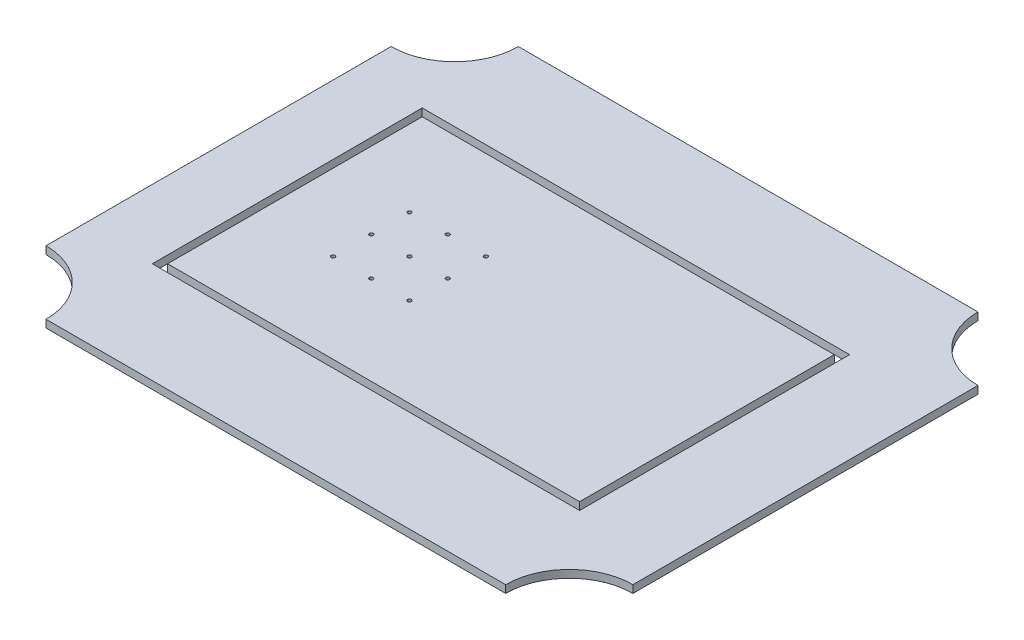
ISO-10303-21;
HEADER;
FILE_DESCRIPTION(('STEP AP214'),'2;1');
FILE_NAME('part.step','',(''),(''),'','','');
FILE_SCHEMA(('AUTOMOTIVE_DESIGN { 1 0 10303 214 1 1 1 1 }'));
ENDSEC;
DATA;
#1=APPLICATION_CONTEXT('core data for automotive mechanical design processes');
#2=APPLICATION_PROTOCOL_DEFINITION('international standard','automotive_design',2000,#1);
#3=PRODUCT_CONTEXT('',#1,'mechanical');
#4=PRODUCT('Part','Part','',(#3));
#5=PRODUCT_RELATED_PRODUCT_CATEGORY('part','',(#4));
#6=PRODUCT_DEFINITION_FORMATION('','',#4);
#7=PRODUCT_DEFINITION_CONTEXT('part definition',#1,'design');
#8=PRODUCT_DEFINITION('design','',#6,#7);
#9=PRODUCT_DEFINITION_SHAPE('','',#8);
#10=(LENGTH_UNIT() NAMED_UNIT(*) SI_UNIT(.MILLI.,.METRE.));
#11=(NAMED_UNIT(*) PLANE_ANGLE_UNIT() SI_UNIT($,.RADIAN.));
#12=(NAMED_UNIT(*) SI_UNIT($,.STERADIAN.) SOLID_ANGLE_UNIT());
#13=UNCERTAINTY_MEASURE_WITH_UNIT(LENGTH_MEASURE(1.E-05),#10,'distance_accuracy_value','');
#14=(GEOMETRIC_REPRESENTATION_CONTEXT(3) GLOBAL_UNCERTAINTY_ASSIGNED_CONTEXT((#13)) GLOBAL_UNIT_ASSIGNED_CONTEXT((#10,
#11,#12)) REPRESENTATION_CONTEXT('',''));
#15=CARTESIAN_POINT('',(0.,0.,0.));
#16=DIRECTION('',(0.,0.,1.));
#17=DIRECTION('',(1.,0.,0.));
#18=AXIS2_PLACEMENT_3D('',#15,#16,#17);
#19=CARTESIAN_POINT('',(187.933095957237,6.,0.));
#20=DIRECTION('',(1.,0.,0.));
#21=DIRECTION('',(0.,0.,-1.));
#22=AXIS2_PLACEMENT_3D('',#19,#20,#21);
#23=PLANE('',#22);
#24=DIRECTION('',(0.,0.,1.));
#25=VECTOR('',#24,1.);
#26=CARTESIAN_POINT('',(187.933095957237,0.,0.));
#27=LINE('',#26,#25);
#28=CARTESIAN_POINT('',(187.933095957237,0.,-100.));
#29=VERTEX_POINT('',#28);
#30=CARTESIAN_POINT('',(187.933095957237,0.,100.));
#31=VERTEX_POINT('',#30);
#32=EDGE_CURVE('E227',#29,#31,#27,.T.);
#33=ORIENTED_EDGE('',*,*,#32,.F.);
#34=DIRECTION('',(0.,-1.,0.));
#35=VECTOR('',#34,1.);
#36=CARTESIAN_POINT('',(187.933095957237,6.,-100.));
#37=LINE('',#36,#35);
#38=CARTESIAN_POINT('',(187.933095957237,6.,-100.));
#39=VERTEX_POINT('',#38);
#40=EDGE_CURVE('E14',#39,#29,#37,.T.);
#41=ORIENTED_EDGE('',*,*,#40,.F.);
#42=DIRECTION('',(0.,0.,1.));
#43=VECTOR('',#42,1.);
#44=CARTESIAN_POINT('',(187.933095957237,6.,0.));
#45=LINE('',#44,#43);
#46=CARTESIAN_POINT('',(187.933095957237,6.,100.));
#47=VERTEX_POINT('',#46);
#48=EDGE_CURVE('E152',#39,#47,#45,.T.);
#49=ORIENTED_EDGE('',*,*,#48,.T.);
#50=DIRECTION('',(0.,-1.,0.));
#51=VECTOR('',#50,1.);
#52=CARTESIAN_POINT('',(187.933095957237,6.,100.));
#53=LINE('',#52,#51);
#54=EDGE_CURVE('E129',#47,#31,#53,.T.);
#55=ORIENTED_EDGE('',*,*,#54,.T.);
#56=EDGE_LOOP('',(#33,#41,#49,#55));
#57=FACE_BOUND('',#56,.T.);
#58=ADVANCED_FACE('F89',(#57),#23,.T.);
#59=CARTESIAN_POINT('',(0.,6.,-100.));
#60=DIRECTION('',(0.,0.,-1.));
#61=DIRECTION('',(-1.,0.,0.));
#62=AXIS2_PLACEMENT_3D('',#59,#60,#61);
#63=PLANE('',#62);
#64=DIRECTION('',(1.,0.,0.));
#65=VECTOR('',#64,1.);
#66=CARTESIAN_POINT('',(0.,0.,-100.));
#67=LINE('',#66,#65);
#68=CARTESIAN_POINT('',(-135.691499512018,0.,-100.));
#69=VERTEX_POINT('',#68);
#70=EDGE_CURVE('E141',#69,#29,#67,.T.);
#71=ORIENTED_EDGE('',*,*,#70,.F.);
#72=DIRECTION('',(0.,-1.,0.));
#73=VECTOR('',#72,1.);
#74=CARTESIAN_POINT('',(-135.691499512018,6.,-100.));
#75=LINE('',#74,#73);
#76=CARTESIAN_POINT('',(-135.691499512018,6.,-100.));
#77=VERTEX_POINT('',#76);
#78=EDGE_CURVE('E98',#77,#69,#75,.T.);
#79=ORIENTED_EDGE('',*,*,#78,.F.);
#80=DIRECTION('',(1.,0.,0.));
#81=VECTOR('',#80,1.);
#82=CARTESIAN_POINT('',(0.,6.,-100.));
#83=LINE('',#82,#81);
#84=EDGE_CURVE('E139',#77,#39,#83,.T.);
#85=ORIENTED_EDGE('',*,*,#84,.T.);
#86=ORIENTED_EDGE('',*,*,#40,.T.);
#87=EDGE_LOOP('',(#71,#79,#85,#86));
#88=FACE_BOUND('',#87,.T.);
#89=ADVANCED_FACE('F137',(#88),#63,.T.);
#90=CARTESIAN_POINT('',(-135.691499512018,6.,0.));
#91=DIRECTION('',(1.,0.,0.));
#92=DIRECTION('',(0.,0.,-1.));
#93=AXIS2_PLACEMENT_3D('',#90,#91,#92);
#94=PLANE('',#93);
#95=DIRECTION('',(0.,0.,1.));
#96=VECTOR('',#95,1.);
#97=CARTESIAN_POINT('',(-135.691499512018,0.,0.));
#98=LINE('',#97,#96);
#99=CARTESIAN_POINT('',(-135.691499512018,0.,100.));
#100=VERTEX_POINT('',#99);
#101=EDGE_CURVE('E237',#69,#100,#98,.T.);
#102=ORIENTED_EDGE('',*,*,#101,.T.);
#103=DIRECTION('',(0.,-1.,0.));
#104=VECTOR('',#103,1.);
#105=CARTESIAN_POINT('',(-135.691499512018,6.,100.));
#106=LINE('',#105,#104);
#107=CARTESIAN_POINT('',(-135.691499512018,6.,100.));
#108=VERTEX_POINT('',#107);
#109=EDGE_CURVE('E144',#108,#100,#106,.T.);
#110=ORIENTED_EDGE('',*,*,#109,.F.);
#111=DIRECTION('',(0.,0.,1.));
#112=VECTOR('',#111,1.);
#113=CARTESIAN_POINT('',(-135.691499512018,6.,0.));
#114=LINE('',#113,#112);
#115=EDGE_CURVE('E146',#77,#108,#114,.T.);
#116=ORIENTED_EDGE('',*,*,#115,.F.);
#117=ORIENTED_EDGE('',*,*,#78,.T.);
#118=EDGE_LOOP('',(#102,#110,#116,#117));
#119=FACE_BOUND('',#118,.T.);
#120=ADVANCED_FACE('F147',(#119),#94,.F.);
#121=CARTESIAN_POINT('',(-75.6914995120183,6.,30.));
#122=DIRECTION('',(0.,-1.,0.));
#123=DIRECTION('',(0.,0.,-1.));
#124=AXIS2_PLACEMENT_3D('',#121,#122,#123);
#125=CYLINDRICAL_SURFACE('',#124,1.49999999999994);
#126=CARTESIAN_POINT('',(-75.6914995120183,6.,30.));
#127=DIRECTION('',(0.,1.,0.));
#128=DIRECTION('',(0.,0.,1.));
#129=AXIS2_PLACEMENT_3D('',#126,#127,#128);
#130=CIRCLE('',#129,1.49999999999994);
#131=CARTESIAN_POINT('',(-75.6914995120183,6.,31.4999999999999));
#132=VERTEX_POINT('',#131);
#133=EDGE_CURVE('E434',#132,#132,#130,.F.);
#134=ORIENTED_EDGE('',*,*,#133,.F.);
#135=EDGE_LOOP('',(#134));
#136=FACE_BOUND('',#135,.T.);
#137=CARTESIAN_POINT('',(-75.6914995120183,0.,30.));
#138=DIRECTION('',(0.,1.,0.));
#139=DIRECTION('',(0.,0.,1.));
#140=AXIS2_PLACEMENT_3D('',#137,#138,#139);
#141=CIRCLE('',#140,1.49999999999994);
#142=CARTESIAN_POINT('',(-75.6914995120183,0.,31.4999999999999));
#143=VERTEX_POINT('',#142);
#144=EDGE_CURVE('E240',#143,#143,#141,.F.);
#145=ORIENTED_EDGE('',*,*,#144,.T.);
#146=EDGE_LOOP('',(#145));
#147=FACE_BOUND('',#146,.T.);
#148=ADVANCED_FACE('F311',(#136,#147),#125,.F.);
#149=CARTESIAN_POINT('',(0.,6.,100.));
#150=DIRECTION('',(0.,0.,-1.));
#151=DIRECTION('',(-1.,0.,0.));
#152=AXIS2_PLACEMENT_3D('',#149,#150,#151);
#153=PLANE('',#152);
#154=DIRECTION('',(1.,0.,0.));
#155=VECTOR('',#154,1.);
#156=CARTESIAN_POINT('',(0.,0.,100.));
#157=LINE('',#156,#155);
#158=EDGE_CURVE('E122',#100,#31,#157,.T.);
#159=ORIENTED_EDGE('',*,*,#158,.T.);
#160=ORIENTED_EDGE('',*,*,#54,.F.);
#161=DIRECTION('',(1.,0.,0.));
#162=VECTOR('',#161,1.);
#163=CARTESIAN_POINT('',(0.,6.,100.));
#164=LINE('',#163,#162);
#165=EDGE_CURVE('E106',#108,#47,#164,.T.);
#166=ORIENTED_EDGE('',*,*,#165,.F.);
#167=ORIENTED_EDGE('',*,*,#109,.T.);
#168=EDGE_LOOP('',(#159,#160,#166,#167));
#169=FACE_BOUND('',#168,.T.);
#170=ADVANCED_FACE('F221',(#169),#153,.F.);
#171=CARTESIAN_POINT('',(-75.6914995120183,6.,0.));
#172=DIRECTION('',(0.,-1.,0.));
#173=DIRECTION('',(0.,0.,-1.));
#174=AXIS2_PLACEMENT_3D('',#171,#172,#173);
#175=CYLINDRICAL_SURFACE('',#174,1.49999999999994);
#176=CARTESIAN_POINT('',(-75.6914995120183,6.,0.));
#177=DIRECTION('',(0.,1.,0.));
#178=DIRECTION('',(0.,0.,1.));
#179=AXIS2_PLACEMENT_3D('',#176,#177,#178);
#180=CIRCLE('',#179,1.49999999999994);
#181=CARTESIAN_POINT('',(-75.6914995120183,6.,1.49999999999994));
#182=VERTEX_POINT('',#181);
#183=EDGE_CURVE('E156',#182,#182,#180,.T.);
#184=ORIENTED_EDGE('',*,*,#183,.T.);
#185=EDGE_LOOP('',(#184));
#186=FACE_BOUND('',#185,.T.);
#187=CARTESIAN_POINT('',(-75.6914995120183,0.,0.));
#188=DIRECTION('',(0.,1.,0.));
#189=DIRECTION('',(0.,0.,1.));
#190=AXIS2_PLACEMENT_3D('',#187,#188,#189);
#191=CIRCLE('',#190,1.49999999999994);
#192=CARTESIAN_POINT('',(-75.6914995120183,0.,1.49999999999994));
#193=VERTEX_POINT('',#192);
#194=EDGE_CURVE('E225',#193,#193,#191,.T.);
#195=ORIENTED_EDGE('',*,*,#194,.F.);
#196=EDGE_LOOP('',(#195));
#197=FACE_BOUND('',#196,.T.);
#198=ADVANCED_FACE('F217',(#186,#197),#175,.F.);
#199=CARTESIAN_POINT('',(-75.6914995120183,6.,-30.));
#200=DIRECTION('',(0.,-1.,0.));
#201=DIRECTION('',(0.,0.,-1.));
#202=AXIS2_PLACEMENT_3D('',#199,#200,#201);
#203=CYLINDRICAL_SURFACE('',#202,1.49999999999994);
#204=CARTESIAN_POINT('',(-75.6914995120183,6.,-30.));
#205=DIRECTION('',(0.,1.,0.));
#206=DIRECTION('',(0.,0.,1.));
#207=AXIS2_PLACEMENT_3D('',#204,#205,#206);
#208=CIRCLE('',#207,1.49999999999994);
#209=CARTESIAN_POINT('',(-75.6914995120183,6.,-28.5000000000001));
#210=VERTEX_POINT('',#209);
#211=EDGE_CURVE('E171',#210,#210,#208,.T.);
#212=ORIENTED_EDGE('',*,*,#211,.T.);
#213=EDGE_LOOP('',(#212));
#214=FACE_BOUND('',#213,.T.);
#215=CARTESIAN_POINT('',(-75.6914995120183,0.,-30.));
#216=DIRECTION('',(0.,1.,0.));
#217=DIRECTION('',(0.,0.,1.));
#218=AXIS2_PLACEMENT_3D('',#215,#216,#217);
#219=CIRCLE('',#218,1.49999999999994);
#220=CARTESIAN_POINT('',(-75.6914995120183,0.,-28.5000000000001));
#221=VERTEX_POINT('',#220);
#222=EDGE_CURVE('E228',#221,#221,#219,.T.);
#223=ORIENTED_EDGE('',*,*,#222,.F.);
#224=EDGE_LOOP('',(#223));
#225=FACE_BOUND('',#224,.T.);
#226=ADVANCED_FACE('F220',(#214,#225),#203,.F.);
#227=CARTESIAN_POINT('',(-45.6914995120183,6.,-30.));
#228=DIRECTION('',(0.,-1.,0.));
#229=DIRECTION('',(0.,0.,-1.));
#230=AXIS2_PLACEMENT_3D('',#227,#228,#229);
#231=CYLINDRICAL_SURFACE('',#230,1.49999999999994);
#232=CARTESIAN_POINT('',(-45.6914995120183,6.,-30.));
#233=DIRECTION('',(0.,1.,0.));
#234=DIRECTION('',(0.,0.,1.));
#235=AXIS2_PLACEMENT_3D('',#232,#233,#234);
#236=CIRCLE('',#235,1.49999999999994);
#237=CARTESIAN_POINT('',(-45.6914995120183,6.,-28.5000000000001));
#238=VERTEX_POINT('',#237);
#239=EDGE_CURVE('E176',#238,#238,#236,.T.);
#240=ORIENTED_EDGE('',*,*,#239,.T.);
#241=EDGE_LOOP('',(#240));
#242=FACE_BOUND('',#241,.T.);
#243=CARTESIAN_POINT('',(-45.6914995120183,0.,-30.));
#244=DIRECTION('',(0.,1.,0.));
#245=DIRECTION('',(0.,0.,1.));
#246=AXIS2_PLACEMENT_3D('',#243,#244,#245);
#247=CIRCLE('',#246,1.49999999999994);
#248=CARTESIAN_POINT('',(-45.6914995120183,0.,-28.5000000000001));
#249=VERTEX_POINT('',#248);
#250=EDGE_CURVE('E232',#249,#249,#247,.T.);
#251=ORIENTED_EDGE('',*,*,#250,.F.);
#252=EDGE_LOOP('',(#251));
#253=FACE_BOUND('',#252,.T.);
#254=ADVANCED_FACE('F260',(#242,#253),#231,.F.);
#255=CARTESIAN_POINT('',(-45.6914995120183,6.,0.));
#256=DIRECTION('',(0.,-1.,0.));
#257=DIRECTION('',(0.,0.,-1.));
#258=AXIS2_PLACEMENT_3D('',#255,#256,#257);
#259=CYLINDRICAL_SURFACE('',#258,1.49999999999992);
#260=CARTESIAN_POINT('',(-45.6914995120183,6.,0.));
#261=DIRECTION('',(0.,1.,0.));
#262=DIRECTION('',(0.,0.,1.));
#263=AXIS2_PLACEMENT_3D('',#260,#261,#262);
#264=CIRCLE('',#263,1.49999999999992);
#265=CARTESIAN_POINT('',(-45.6914995120183,6.,1.49999999999992));
#266=VERTEX_POINT('',#265);
#267=EDGE_CURVE('E181',#266,#266,#264,.T.);
#268=ORIENTED_EDGE('',*,*,#267,.T.);
#269=EDGE_LOOP('',(#268));
#270=FACE_BOUND('',#269,.T.);
#271=CARTESIAN_POINT('',(-45.6914995120183,0.,0.));
#272=DIRECTION('',(0.,1.,0.));
#273=DIRECTION('',(0.,0.,1.));
#274=AXIS2_PLACEMENT_3D('',#271,#272,#273);
#275=CIRCLE('',#274,1.49999999999992);
#276=CARTESIAN_POINT('',(-45.6914995120183,0.,1.49999999999992));
#277=VERTEX_POINT('',#276);
#278=EDGE_CURVE('E287',#277,#277,#275,.T.);
#279=ORIENTED_EDGE('',*,*,#278,.F.);
#280=EDGE_LOOP('',(#279));
#281=FACE_BOUND('',#280,.T.);
#282=ADVANCED_FACE('F202',(#270,#281),#259,.F.);
#283=CARTESIAN_POINT('',(-45.6914995120183,6.,30.));
#284=DIRECTION('',(0.,-1.,0.));
#285=DIRECTION('',(0.,0.,-1.));
#286=AXIS2_PLACEMENT_3D('',#283,#284,#285);
#287=CYLINDRICAL_SURFACE('',#286,1.49999999999994);
#288=CARTESIAN_POINT('',(-45.6914995120183,6.,30.));
#289=DIRECTION('',(0.,1.,0.));
#290=DIRECTION('',(0.,0.,1.));
#291=AXIS2_PLACEMENT_3D('',#288,#289,#290);
#292=CIRCLE('',#291,1.49999999999994);
#293=CARTESIAN_POINT('',(-45.6914995120183,6.,31.4999999999999));
#294=VERTEX_POINT('',#293);
#295=EDGE_CURVE('E192',#294,#294,#292,.F.);
#296=ORIENTED_EDGE('',*,*,#295,.F.);
#297=EDGE_LOOP('',(#296));
#298=FACE_BOUND('',#297,.T.);
#299=CARTESIAN_POINT('',(-45.6914995120183,0.,30.));
#300=DIRECTION('',(0.,1.,0.));
#301=DIRECTION('',(0.,0.,1.));
#302=AXIS2_PLACEMENT_3D('',#299,#300,#301);
#303=CIRCLE('',#302,1.49999999999994);
#304=CARTESIAN_POINT('',(-45.6914995120183,0.,31.4999999999999));
#305=VERTEX_POINT('',#304);
#306=EDGE_CURVE('E283',#305,#305,#303,.F.);
#307=ORIENTED_EDGE('',*,*,#306,.T.);
#308=EDGE_LOOP('',(#307));
#309=FACE_BOUND('',#308,.T.);
#310=ADVANCED_FACE('F267',(#298,#309),#287,.F.);
#311=CARTESIAN_POINT('',(-15.6914995120183,6.,30.));
#312=DIRECTION('',(0.,-1.,0.));
#313=DIRECTION('',(0.,0.,-1.));
#314=AXIS2_PLACEMENT_3D('',#311,#312,#313);
#315=CYLINDRICAL_SURFACE('',#314,1.49999999999989);
#316=CARTESIAN_POINT('',(-15.6914995120183,6.,30.));
#317=DIRECTION('',(0.,1.,0.));
#318=DIRECTION('',(0.,0.,1.));
#319=AXIS2_PLACEMENT_3D('',#316,#317,#318);
#320=CIRCLE('',#319,1.49999999999989);
#321=CARTESIAN_POINT('',(-15.6914995120183,6.,31.4999999999999));
#322=VERTEX_POINT('',#321);
#323=EDGE_CURVE('E187',#322,#322,#320,.T.);
#324=ORIENTED_EDGE('',*,*,#323,.T.);
#325=EDGE_LOOP('',(#324));
#326=FACE_BOUND('',#325,.T.);
#327=CARTESIAN_POINT('',(-15.6914995120183,0.,30.));
#328=DIRECTION('',(0.,1.,0.));
#329=DIRECTION('',(0.,0.,1.));
#330=AXIS2_PLACEMENT_3D('',#327,#328,#329);
#331=CIRCLE('',#330,1.49999999999989);
#332=CARTESIAN_POINT('',(-15.6914995120183,0.,31.4999999999999));
#333=VERTEX_POINT('',#332);
#334=EDGE_CURVE('E281',#333,#333,#331,.T.);
#335=ORIENTED_EDGE('',*,*,#334,.F.);
#336=EDGE_LOOP('',(#335));
#337=FACE_BOUND('',#336,.T.);
#338=ADVANCED_FACE('F269',(#326,#337),#315,.F.);
#339=CARTESIAN_POINT('',(-15.6914995120183,6.,0.));
#340=DIRECTION('',(0.,-1.,0.));
#341=DIRECTION('',(0.,0.,-1.));
#342=AXIS2_PLACEMENT_3D('',#339,#340,#341);
#343=CYLINDRICAL_SURFACE('',#342,1.49999999999989);
#344=CARTESIAN_POINT('',(-15.6914995120183,6.,0.));
#345=DIRECTION('',(0.,1.,0.));
#346=DIRECTION('',(0.,0.,1.));
#347=AXIS2_PLACEMENT_3D('',#344,#345,#346);
#348=CIRCLE('',#347,1.49999999999989);
#349=CARTESIAN_POINT('',(-15.6914995120183,6.,1.49999999999988));
#350=VERTEX_POINT('',#349);
#351=EDGE_CURVE('E193',#350,#350,#348,.F.);
#352=ORIENTED_EDGE('',*,*,#351,.F.);
#353=EDGE_LOOP('',(#352));
#354=FACE_BOUND('',#353,.T.);
#355=CARTESIAN_POINT('',(-15.6914995120183,0.,0.));
#356=DIRECTION('',(0.,1.,0.));
#357=DIRECTION('',(0.,0.,1.));
#358=AXIS2_PLACEMENT_3D('',#355,#356,#357);
#359=CIRCLE('',#358,1.49999999999989);
#360=CARTESIAN_POINT('',(-15.6914995120183,0.,1.49999999999988));
#361=VERTEX_POINT('',#360);
#362=EDGE_CURVE('E284',#361,#361,#359,.F.);
#363=ORIENTED_EDGE('',*,*,#362,.T.);
#364=EDGE_LOOP('',(#363));
#365=FACE_BOUND('',#364,.T.);
#366=ADVANCED_FACE('F91',(#354,#365),#343,.F.);
#367=CARTESIAN_POINT('',(-15.6914995120183,6.,-30.));
#368=DIRECTION('',(0.,-1.,0.));
#369=DIRECTION('',(0.,0.,-1.));
#370=AXIS2_PLACEMENT_3D('',#367,#368,#369);
#371=CYLINDRICAL_SURFACE('',#370,1.49999999999989);
#372=CARTESIAN_POINT('',(-15.6914995120183,6.,-30.));
#373=DIRECTION('',(0.,1.,0.));
#374=DIRECTION('',(0.,0.,1.));
#375=AXIS2_PLACEMENT_3D('',#372,#373,#374);
#376=CIRCLE('',#375,1.49999999999989);
#377=CARTESIAN_POINT('',(-15.6914995120183,6.,-28.5000000000001));
#378=VERTEX_POINT('',#377);
#379=EDGE_CURVE('E247',#378,#378,#376,.F.);
#380=ORIENTED_EDGE('',*,*,#379,.F.);
#381=EDGE_LOOP('',(#380));
#382=FACE_BOUND('',#381,.T.);
#383=CARTESIAN_POINT('',(-15.6914995120183,0.,-30.));
#384=DIRECTION('',(0.,1.,0.));
#385=DIRECTION('',(0.,0.,1.));
#386=AXIS2_PLACEMENT_3D('',#383,#384,#385);
#387=CIRCLE('',#386,1.49999999999989);
#388=CARTESIAN_POINT('',(-15.6914995120183,0.,-28.5000000000001));
#389=VERTEX_POINT('',#388);
#390=EDGE_CURVE('E243',#389,#389,#387,.F.);
#391=ORIENTED_EDGE('',*,*,#390,.T.);
#392=EDGE_LOOP('',(#391));
#393=FACE_BOUND('',#392,.T.);
#394=ADVANCED_FACE('F208',(#382,#393),#371,.F.);
#395=CARTESIAN_POINT('',(0.,6.,0.));
#396=DIRECTION('',(0.,1.,0.));
#397=DIRECTION('',(0.,0.,1.));
#398=AXIS2_PLACEMENT_3D('',#395,#396,#397);
#399=PLANE('',#398);
#400=ORIENTED_EDGE('',*,*,#351,.T.);
#401=EDGE_LOOP('',(#400));
#402=FACE_BOUND('',#401,.T.);
#403=ORIENTED_EDGE('',*,*,#323,.F.);
#404=EDGE_LOOP('',(#403));
#405=FACE_BOUND('',#404,.T.);
#406=ORIENTED_EDGE('',*,*,#295,.T.);
#407=EDGE_LOOP('',(#406));
#408=FACE_BOUND('',#407,.T.);
#409=ORIENTED_EDGE('',*,*,#267,.F.);
#410=EDGE_LOOP('',(#409));
#411=FACE_BOUND('',#410,.T.);
#412=ORIENTED_EDGE('',*,*,#239,.F.);
#413=EDGE_LOOP('',(#412));
#414=FACE_BOUND('',#413,.T.);
#415=ORIENTED_EDGE('',*,*,#211,.F.);
#416=EDGE_LOOP('',(#415));
#417=FACE_BOUND('',#416,.T.);
#418=ORIENTED_EDGE('',*,*,#183,.F.);
#419=EDGE_LOOP('',(#418));
#420=FACE_BOUND('',#419,.T.);
#421=ORIENTED_EDGE('',*,*,#48,.F.);
#422=ORIENTED_EDGE('',*,*,#84,.F.);
#423=ORIENTED_EDGE('',*,*,#115,.T.);
#424=ORIENTED_EDGE('',*,*,#165,.T.);
#425=EDGE_LOOP('',(#421,#422,#423,#424));
#426=FACE_BOUND('',#425,.T.);
#427=ORIENTED_EDGE('',*,*,#133,.T.);
#428=EDGE_LOOP('',(#427));
#429=FACE_BOUND('',#428,.T.);
#430=ORIENTED_EDGE('',*,*,#379,.T.);
#431=EDGE_LOOP('',(#430));
#432=FACE_BOUND('',#431,.T.);
#433=ADVANCED_FACE('F150',(#402,#405,#408,#411,#414,#417,#420,#426,#429,#432),#399,.T.);
#434=CARTESIAN_POINT('',(0.,0.,0.));
#435=DIRECTION('',(0.,1.,0.));
#436=DIRECTION('',(0.,0.,1.));
#437=AXIS2_PLACEMENT_3D('',#434,#435,#436);
#438=PLANE('',#437);
#439=ORIENTED_EDGE('',*,*,#362,.F.);
#440=EDGE_LOOP('',(#439));
#441=FACE_BOUND('',#440,.T.);
#442=ORIENTED_EDGE('',*,*,#334,.T.);
#443=EDGE_LOOP('',(#442));
#444=FACE_BOUND('',#443,.T.);
#445=ORIENTED_EDGE('',*,*,#306,.F.);
#446=EDGE_LOOP('',(#445));
#447=FACE_BOUND('',#446,.T.);
#448=ORIENTED_EDGE('',*,*,#278,.T.);
#449=EDGE_LOOP('',(#448));
#450=FACE_BOUND('',#449,.T.);
#451=ORIENTED_EDGE('',*,*,#250,.T.);
#452=EDGE_LOOP('',(#451));
#453=FACE_BOUND('',#452,.T.);
#454=ORIENTED_EDGE('',*,*,#222,.T.);
#455=EDGE_LOOP('',(#454));
#456=FACE_BOUND('',#455,.T.);
#457=ORIENTED_EDGE('',*,*,#194,.T.);
#458=EDGE_LOOP('',(#457));
#459=FACE_BOUND('',#458,.T.);
#460=ORIENTED_EDGE('',*,*,#32,.T.);
#461=ORIENTED_EDGE('',*,*,#158,.F.);
#462=ORIENTED_EDGE('',*,*,#101,.F.);
#463=ORIENTED_EDGE('',*,*,#70,.T.);
#464=EDGE_LOOP('',(#460,#461,#462,#463));
#465=FACE_BOUND('',#464,.T.);
#466=ORIENTED_EDGE('',*,*,#144,.F.);
#467=EDGE_LOOP('',(#466));
#468=FACE_BOUND('',#467,.T.);
#469=ORIENTED_EDGE('',*,*,#390,.F.);
#470=EDGE_LOOP('',(#469));
#471=FACE_BOUND('',#470,.T.);
#472=ADVANCED_FACE('F207',(#441,#444,#447,#450,#453,#456,#459,#465,#468,#471),#438,.F.);
#473=CLOSED_SHELL('',(#58,#89,#120,#148,#170,#198,#226,#254,#282,#310,#338,#366,#394,#433,#472));
#474=MANIFOLD_SOLID_BREP('B2',#473);
#475=CARTESIAN_POINT('',(-141.691499512018,6.,0.));
#476=DIRECTION('',(1.,0.,0.));
#477=DIRECTION('',(0.,0.,-1.));
#478=AXIS2_PLACEMENT_3D('',#475,#476,#477);
#479=PLANE('',#478);
#480=DIRECTION('',(0.,0.,1.));
#481=VECTOR('',#480,1.);
#482=CARTESIAN_POINT('',(-141.691499512018,0.,0.));
#483=LINE('',#482,#481);
#484=CARTESIAN_POINT('',(-141.691499512018,0.,-106.));
#485=VERTEX_POINT('',#484);
#486=CARTESIAN_POINT('',(-141.691499512018,0.,106.));
#487=VERTEX_POINT('',#486);
#488=EDGE_CURVE('E610',#485,#487,#483,.T.);
#489=ORIENTED_EDGE('',*,*,#488,.F.);
#490=DIRECTION('',(0.,-1.,0.));
#491=VECTOR('',#490,1.);
#492=CARTESIAN_POINT('',(-141.691499512018,6.,-106.));
#493=LINE('',#492,#491);
#494=CARTESIAN_POINT('',(-141.691499512018,6.,-106.));
#495=VERTEX_POINT('',#494);
#496=EDGE_CURVE('E87',#495,#485,#493,.T.);
#497=ORIENTED_EDGE('',*,*,#496,.F.);
#498=DIRECTION('',(0.,0.,1.));
#499=VECTOR('',#498,1.);
#500=CARTESIAN_POINT('',(-141.691499512018,6.,0.));
#501=LINE('',#500,#499);
#502=CARTESIAN_POINT('',(-141.691499512018,6.,106.));
#503=VERTEX_POINT('',#502);
#504=EDGE_CURVE('E572',#495,#503,#501,.T.);
#505=ORIENTED_EDGE('',*,*,#504,.T.);
#506=DIRECTION('',(0.,-1.,0.));
#507=VECTOR('',#506,1.);
#508=CARTESIAN_POINT('',(-141.691499512018,6.,106.));
#509=LINE('',#508,#507);
#510=EDGE_CURVE('E481',#503,#487,#509,.T.);
#511=ORIENTED_EDGE('',*,*,#510,.T.);
#512=EDGE_LOOP('',(#489,#497,#505,#511));
#513=FACE_BOUND('',#512,.T.);
#514=ADVANCED_FACE('F462',(#513),#479,.T.);
#515=CARTESIAN_POINT('',(0.,6.,-106.));
#516=DIRECTION('',(0.,0.,-1.));
#517=DIRECTION('',(-1.,0.,0.));
#518=AXIS2_PLACEMENT_3D('',#515,#516,#517);
#519=PLANE('',#518);
#520=DIRECTION('',(1.,0.,0.));
#521=VECTOR('',#520,1.);
#522=CARTESIAN_POINT('',(0.,0.,-106.));
#523=LINE('',#522,#521);
#524=CARTESIAN_POINT('',(193.933095957237,0.,-106.));
#525=VERTEX_POINT('',#524);
#526=EDGE_CURVE('E578',#485,#525,#523,.T.);
#527=ORIENTED_EDGE('',*,*,#526,.T.);
#528=DIRECTION('',(0.,-1.,0.));
#529=VECTOR('',#528,1.);
#530=CARTESIAN_POINT('',(193.933095957237,6.,-106.));
#531=LINE('',#530,#529);
#532=CARTESIAN_POINT('',(193.933095957237,6.,-106.));
#533=VERTEX_POINT('',#532);
#534=EDGE_CURVE('E472',#533,#525,#531,.T.);
#535=ORIENTED_EDGE('',*,*,#534,.F.);
#536=DIRECTION('',(1.,0.,0.));
#537=VECTOR('',#536,1.);
#538=CARTESIAN_POINT('',(0.,6.,-106.));
#539=LINE('',#538,#537);
#540=EDGE_CURVE('E567',#495,#533,#539,.T.);
#541=ORIENTED_EDGE('',*,*,#540,.F.);
#542=ORIENTED_EDGE('',*,*,#496,.T.);
#543=EDGE_LOOP('',(#527,#535,#541,#542));
#544=FACE_BOUND('',#543,.T.);
#545=ADVANCED_FACE('F576',(#544),#519,.F.);
#546=CARTESIAN_POINT('',(193.933095957237,6.,0.));
#547=DIRECTION('',(1.,0.,0.));
#548=DIRECTION('',(0.,0.,-1.));
#549=AXIS2_PLACEMENT_3D('',#546,#547,#548);
#550=PLANE('',#549);
#551=DIRECTION('',(0.,0.,1.));
#552=VECTOR('',#551,1.);
#553=CARTESIAN_POINT('',(193.933095957237,0.,0.));
#554=LINE('',#553,#552);
#555=CARTESIAN_POINT('',(193.933095957237,0.,106.));
#556=VERTEX_POINT('',#555);
#557=EDGE_CURVE('E607',#525,#556,#554,.T.);
#558=ORIENTED_EDGE('',*,*,#557,.T.);
#559=DIRECTION('',(0.,-1.,0.));
#560=VECTOR('',#559,1.);
#561=CARTESIAN_POINT('',(193.933095957237,6.,106.));
#562=LINE('',#561,#560);
#563=CARTESIAN_POINT('',(193.933095957237,6.,106.));
#564=VERTEX_POINT('',#563);
#565=EDGE_CURVE('E519',#564,#556,#562,.T.);
#566=ORIENTED_EDGE('',*,*,#565,.F.);
#567=DIRECTION('',(0.,0.,1.));
#568=VECTOR('',#567,1.);
#569=CARTESIAN_POINT('',(193.933095957237,6.,0.));
#570=LINE('',#569,#568);
#571=EDGE_CURVE('E558',#533,#564,#570,.T.);
#572=ORIENTED_EDGE('',*,*,#571,.F.);
#573=ORIENTED_EDGE('',*,*,#534,.T.);
#574=EDGE_LOOP('',(#558,#566,#572,#573));
#575=FACE_BOUND('',#574,.T.);
#576=ADVANCED_FACE('F560',(#575),#550,.F.);
#577=CARTESIAN_POINT('',(-195.691499512018,6.,185.5));
#578=DIRECTION('',(0.,-1.,0.));
#579=DIRECTION('',(0.,0.,-1.));
#580=AXIS2_PLACEMENT_3D('',#577,#578,#579);
#581=CYLINDRICAL_SURFACE('',#580,50.);
#582=CARTESIAN_POINT('',(-195.691499512018,0.,185.5));
#583=DIRECTION('',(0.,1.,0.));
#584=DIRECTION('',(0.,0.,1.));
#585=AXIS2_PLACEMENT_3D('',#582,#583,#584);
#586=CIRCLE('',#585,50.);
#587=CARTESIAN_POINT('',(-145.691499512018,0.,185.5));
#588=VERTEX_POINT('',#587);
#589=CARTESIAN_POINT('',(-195.691499512018,0.,135.5));
#590=VERTEX_POINT('',#589);
#591=EDGE_CURVE('E632',#588,#590,#586,.T.);
#592=ORIENTED_EDGE('',*,*,#591,.F.);
#593=DIRECTION('',(0.,-1.,0.));
#594=VECTOR('',#593,1.);
#595=CARTESIAN_POINT('',(-145.691499512018,6.,185.5));
#596=LINE('',#595,#594);
#597=CARTESIAN_POINT('',(-145.691499512018,6.,185.5));
#598=VERTEX_POINT('',#597);
#599=EDGE_CURVE('E466',#598,#588,#596,.T.);
#600=ORIENTED_EDGE('',*,*,#599,.F.);
#601=CARTESIAN_POINT('',(-195.691499512018,6.,185.5));
#602=DIRECTION('',(0.,1.,0.));
#603=DIRECTION('',(0.,0.,1.));
#604=AXIS2_PLACEMENT_3D('',#601,#602,#603);
#605=CIRCLE('',#604,50.);
#606=CARTESIAN_POINT('',(-195.691499512018,6.,135.5));
#607=VERTEX_POINT('',#606);
#608=EDGE_CURVE('E606',#598,#607,#605,.T.);
#609=ORIENTED_EDGE('',*,*,#608,.T.);
#610=DIRECTION('',(0.,-1.,0.));
#611=VECTOR('',#610,1.);
#612=CARTESIAN_POINT('',(-195.691499512018,6.,135.5));
#613=LINE('',#612,#611);
#614=EDGE_CURVE('E583',#607,#590,#613,.T.);
#615=ORIENTED_EDGE('',*,*,#614,.T.);
#616=EDGE_LOOP('',(#592,#600,#609,#615));
#617=FACE_BOUND('',#616,.T.);
#618=ADVANCED_FACE('F464',(#617),#581,.F.);
#619=CARTESIAN_POINT('',(0.,6.,185.5));
#620=DIRECTION('',(0.,0.,-1.));
#621=DIRECTION('',(-1.,0.,0.));
#622=AXIS2_PLACEMENT_3D('',#619,#620,#621);
#623=PLANE('',#622);
#624=DIRECTION('',(1.,0.,0.));
#625=VECTOR('',#624,1.);
#626=CARTESIAN_POINT('',(0.,0.,185.5));
#627=LINE('',#626,#625);
#628=CARTESIAN_POINT('',(215.308500487982,0.,185.5));
#629=VERTEX_POINT('',#628);
#630=EDGE_CURVE('E630',#588,#629,#627,.T.);
#631=ORIENTED_EDGE('',*,*,#630,.T.);
#632=DIRECTION('',(0.,-1.,0.));
#633=VECTOR('',#632,1.);
#634=CARTESIAN_POINT('',(215.308500487982,6.,185.5));
#635=LINE('',#634,#633);
#636=CARTESIAN_POINT('',(215.308500487982,6.,185.5));
#637=VERTEX_POINT('',#636);
#638=EDGE_CURVE('E594',#637,#629,#635,.T.);
#639=ORIENTED_EDGE('',*,*,#638,.F.);
#640=DIRECTION('',(1.,0.,0.));
#641=VECTOR('',#640,1.);
#642=CARTESIAN_POINT('',(0.,6.,185.5));
#643=LINE('',#642,#641);
#644=EDGE_CURVE('E676',#598,#637,#643,.T.);
#645=ORIENTED_EDGE('',*,*,#644,.F.);
#646=ORIENTED_EDGE('',*,*,#599,.T.);
#647=EDGE_LOOP('',(#631,#639,#645,#646));
#648=FACE_BOUND('',#647,.T.);
#649=ADVANCED_FACE('F688',(#648),#623,.F.);
#650=CARTESIAN_POINT('',(265.308500487982,6.,185.5));
#651=DIRECTION('',(0.,-1.,0.));
#652=DIRECTION('',(0.,0.,-1.));
#653=AXIS2_PLACEMENT_3D('',#650,#651,#652);
#654=CYLINDRICAL_SURFACE('',#653,50.);
#655=CARTESIAN_POINT('',(265.308500487982,0.,185.5));
#656=DIRECTION('',(0.,1.,0.));
#657=DIRECTION('',(0.,0.,1.));
#658=AXIS2_PLACEMENT_3D('',#655,#656,#657);
#659=CIRCLE('',#658,50.);
#660=CARTESIAN_POINT('',(265.308500487982,0.,135.5));
#661=VERTEX_POINT('',#660);
#662=EDGE_CURVE('E627',#661,#629,#659,.T.);
#663=ORIENTED_EDGE('',*,*,#662,.F.);
#664=DIRECTION('',(0.,-1.,0.));
#665=VECTOR('',#664,1.);
#666=CARTESIAN_POINT('',(265.308500487982,6.,135.5));
#667=LINE('',#666,#665);
#668=CARTESIAN_POINT('',(265.308500487982,6.,135.5));
#669=VERTEX_POINT('',#668);
#670=EDGE_CURVE('E593',#669,#661,#667,.T.);
#671=ORIENTED_EDGE('',*,*,#670,.F.);
#672=CARTESIAN_POINT('',(265.308500487982,6.,185.5));
#673=DIRECTION('',(0.,1.,0.));
#674=DIRECTION('',(0.,0.,1.));
#675=AXIS2_PLACEMENT_3D('',#672,#673,#674);
#676=CIRCLE('',#675,50.);
#677=EDGE_CURVE('E672',#669,#637,#676,.T.);
#678=ORIENTED_EDGE('',*,*,#677,.T.);
#679=ORIENTED_EDGE('',*,*,#638,.T.);
#680=EDGE_LOOP('',(#663,#671,#678,#679));
#681=FACE_BOUND('',#680,.T.);
#682=ADVANCED_FACE('F689',(#681),#654,.F.);
#683=CARTESIAN_POINT('',(265.308500487982,6.,0.));
#684=DIRECTION('',(1.,0.,0.));
#685=DIRECTION('',(0.,0.,-1.));
#686=AXIS2_PLACEMENT_3D('',#683,#684,#685);
#687=PLANE('',#686);
#688=DIRECTION('',(0.,0.,1.));
#689=VECTOR('',#688,1.);
#690=CARTESIAN_POINT('',(265.308500487982,0.,0.));
#691=LINE('',#690,#689);
#692=CARTESIAN_POINT('',(265.308500487982,0.,-135.5));
#693=VERTEX_POINT('',#692);
#694=EDGE_CURVE('E624',#693,#661,#691,.T.);
#695=ORIENTED_EDGE('',*,*,#694,.F.);
#696=DIRECTION('',(0.,-1.,0.));
#697=VECTOR('',#696,1.);
#698=CARTESIAN_POINT('',(265.308500487982,6.,-135.5));
#699=LINE('',#698,#697);
#700=CARTESIAN_POINT('',(265.308500487982,6.,-135.5));
#701=VERTEX_POINT('',#700);
#702=EDGE_CURVE('E591',#701,#693,#699,.T.);
#703=ORIENTED_EDGE('',*,*,#702,.F.);
#704=DIRECTION('',(0.,0.,1.));
#705=VECTOR('',#704,1.);
#706=CARTESIAN_POINT('',(265.308500487982,6.,0.));
#707=LINE('',#706,#705);
#708=EDGE_CURVE('E667',#701,#669,#707,.T.);
#709=ORIENTED_EDGE('',*,*,#708,.T.);
#710=ORIENTED_EDGE('',*,*,#670,.T.);
#711=EDGE_LOOP('',(#695,#703,#709,#710));
#712=FACE_BOUND('',#711,.T.);
#713=ADVANCED_FACE('F692',(#712),#687,.T.);
#714=CARTESIAN_POINT('',(265.308500487982,6.,-185.5));
#715=DIRECTION('',(0.,-1.,0.));
#716=DIRECTION('',(0.,0.,-1.));
#717=AXIS2_PLACEMENT_3D('',#714,#715,#716);
#718=CYLINDRICAL_SURFACE('',#717,50.);
#719=CARTESIAN_POINT('',(265.308500487982,0.,-185.5));
#720=DIRECTION('',(0.,1.,0.));
#721=DIRECTION('',(0.,0.,1.));
#722=AXIS2_PLACEMENT_3D('',#719,#720,#721);
#723=CIRCLE('',#722,50.);
#724=CARTESIAN_POINT('',(215.308500487982,0.,-185.5));
#725=VERTEX_POINT('',#724);
#726=EDGE_CURVE('E621',#725,#693,#723,.T.);
#727=ORIENTED_EDGE('',*,*,#726,.F.);
#728=DIRECTION('',(0.,-1.,0.));
#729=VECTOR('',#728,1.);
#730=CARTESIAN_POINT('',(215.308500487982,6.,-185.5));
#731=LINE('',#730,#729);
#732=CARTESIAN_POINT('',(215.308500487982,6.,-185.5));
#733=VERTEX_POINT('',#732);
#734=EDGE_CURVE('E589',#733,#725,#731,.T.);
#735=ORIENTED_EDGE('',*,*,#734,.F.);
#736=CARTESIAN_POINT('',(265.308500487982,6.,-185.5));
#737=DIRECTION('',(0.,1.,0.));
#738=DIRECTION('',(0.,0.,1.));
#739=AXIS2_PLACEMENT_3D('',#736,#737,#738);
#740=CIRCLE('',#739,50.);
#741=EDGE_CURVE('E663',#733,#701,#740,.T.);
#742=ORIENTED_EDGE('',*,*,#741,.T.);
#743=ORIENTED_EDGE('',*,*,#702,.T.);
#744=EDGE_LOOP('',(#727,#735,#742,#743));
#745=FACE_BOUND('',#744,.T.);
#746=ADVANCED_FACE('F698',(#745),#718,.F.);
#747=CARTESIAN_POINT('',(0.,6.,-185.5));
#748=DIRECTION('',(0.,0.,-1.));
#749=DIRECTION('',(-1.,0.,0.));
#750=AXIS2_PLACEMENT_3D('',#747,#748,#749);
#751=PLANE('',#750);
#752=DIRECTION('',(1.,0.,0.));
#753=VECTOR('',#752,1.);
#754=CARTESIAN_POINT('',(0.,0.,-185.5));
#755=LINE('',#754,#753);
#756=CARTESIAN_POINT('',(-145.691499512018,0.,-185.5));
#757=VERTEX_POINT('',#756);
#758=EDGE_CURVE('E618',#757,#725,#755,.T.);
#759=ORIENTED_EDGE('',*,*,#758,.F.);
#760=DIRECTION('',(0.,-1.,0.));
#761=VECTOR('',#760,1.);
#762=CARTESIAN_POINT('',(-145.691499512018,6.,-185.5));
#763=LINE('',#762,#761);
#764=CARTESIAN_POINT('',(-145.691499512018,6.,-185.5));
#765=VERTEX_POINT('',#764);
#766=EDGE_CURVE('E587',#765,#757,#763,.T.);
#767=ORIENTED_EDGE('',*,*,#766,.F.);
#768=DIRECTION('',(1.,0.,0.));
#769=VECTOR('',#768,1.);
#770=CARTESIAN_POINT('',(0.,6.,-185.5));
#771=LINE('',#770,#769);
#772=EDGE_CURVE('E655',#765,#733,#771,.T.);
#773=ORIENTED_EDGE('',*,*,#772,.T.);
#774=ORIENTED_EDGE('',*,*,#734,.T.);
#775=EDGE_LOOP('',(#759,#767,#773,#774));
#776=FACE_BOUND('',#775,.T.);
#777=ADVANCED_FACE('F701',(#776),#751,.T.);
#778=CARTESIAN_POINT('',(-195.691499512018,6.,-185.5));
#779=DIRECTION('',(0.,-1.,0.));
#780=DIRECTION('',(0.,0.,-1.));
#781=AXIS2_PLACEMENT_3D('',#778,#779,#780);
#782=CYLINDRICAL_SURFACE('',#781,50.);
#783=CARTESIAN_POINT('',(-195.691499512018,0.,-185.5));
#784=DIRECTION('',(0.,1.,0.));
#785=DIRECTION('',(0.,0.,1.));
#786=AXIS2_PLACEMENT_3D('',#783,#784,#785);
#787=CIRCLE('',#786,50.);
#788=CARTESIAN_POINT('',(-195.691499512018,0.,-135.5));
#789=VERTEX_POINT('',#788);
#790=EDGE_CURVE('E615',#789,#757,#787,.T.);
#791=ORIENTED_EDGE('',*,*,#790,.F.);
#792=DIRECTION('',(0.,-1.,0.));
#793=VECTOR('',#792,1.);
#794=CARTESIAN_POINT('',(-195.691499512018,6.,-135.5));
#795=LINE('',#794,#793);
#796=CARTESIAN_POINT('',(-195.691499512018,6.,-135.5));
#797=VERTEX_POINT('',#796);
#798=EDGE_CURVE('E585',#797,#789,#795,.T.);
#799=ORIENTED_EDGE('',*,*,#798,.F.);
#800=CARTESIAN_POINT('',(-195.691499512018,6.,-185.5));
#801=DIRECTION('',(0.,1.,0.));
#802=DIRECTION('',(0.,0.,1.));
#803=AXIS2_PLACEMENT_3D('',#800,#801,#802);
#804=CIRCLE('',#803,50.);
#805=EDGE_CURVE('E650',#797,#765,#804,.T.);
#806=ORIENTED_EDGE('',*,*,#805,.T.);
#807=ORIENTED_EDGE('',*,*,#766,.T.);
#808=EDGE_LOOP('',(#791,#799,#806,#807));
#809=FACE_BOUND('',#808,.T.);
#810=ADVANCED_FACE('F706',(#809),#782,.F.);
#811=CARTESIAN_POINT('',(-195.691499512018,6.,0.));
#812=DIRECTION('',(1.,0.,0.));
#813=DIRECTION('',(0.,0.,-1.));
#814=AXIS2_PLACEMENT_3D('',#811,#812,#813);
#815=PLANE('',#814);
#816=DIRECTION('',(0.,0.,1.));
#817=VECTOR('',#816,1.);
#818=CARTESIAN_POINT('',(-195.691499512018,0.,0.));
#819=LINE('',#818,#817);
#820=EDGE_CURVE('E612',#789,#590,#819,.T.);
#821=ORIENTED_EDGE('',*,*,#820,.T.);
#822=ORIENTED_EDGE('',*,*,#614,.F.);
#823=DIRECTION('',(0.,0.,1.));
#824=VECTOR('',#823,1.);
#825=CARTESIAN_POINT('',(-195.691499512018,6.,0.));
#826=LINE('',#825,#824);
#827=EDGE_CURVE('E646',#797,#607,#826,.T.);
#828=ORIENTED_EDGE('',*,*,#827,.F.);
#829=ORIENTED_EDGE('',*,*,#798,.T.);
#830=EDGE_LOOP('',(#821,#822,#828,#829));
#831=FACE_BOUND('',#830,.T.);
#832=ADVANCED_FACE('F711',(#831),#815,.F.);
#833=CARTESIAN_POINT('',(0.,6.,106.));
#834=DIRECTION('',(0.,0.,-1.));
#835=DIRECTION('',(-1.,0.,0.));
#836=AXIS2_PLACEMENT_3D('',#833,#834,#835);
#837=PLANE('',#836);
#838=DIRECTION('',(1.,0.,0.));
#839=VECTOR('',#838,1.);
#840=CARTESIAN_POINT('',(0.,0.,106.));
#841=LINE('',#840,#839);
#842=EDGE_CURVE('E603',#487,#556,#841,.T.);
#843=ORIENTED_EDGE('',*,*,#842,.F.);
#844=ORIENTED_EDGE('',*,*,#510,.F.);
#845=DIRECTION('',(1.,0.,0.));
#846=VECTOR('',#845,1.);
#847=CARTESIAN_POINT('',(0.,6.,106.));
#848=LINE('',#847,#846);
#849=EDGE_CURVE('E566',#503,#564,#848,.T.);
#850=ORIENTED_EDGE('',*,*,#849,.T.);
#851=ORIENTED_EDGE('',*,*,#565,.T.);
#852=EDGE_LOOP('',(#843,#844,#850,#851));
#853=FACE_BOUND('',#852,.T.);
#854=ADVANCED_FACE('F717',(#853),#837,.T.);
#855=CARTESIAN_POINT('',(0.,6.,0.));
#856=DIRECTION('',(0.,1.,0.));
#857=DIRECTION('',(0.,0.,1.));
#858=AXIS2_PLACEMENT_3D('',#855,#856,#857);
#859=PLANE('',#858);
#860=ORIENTED_EDGE('',*,*,#608,.F.);
#861=ORIENTED_EDGE('',*,*,#644,.T.);
#862=ORIENTED_EDGE('',*,*,#677,.F.);
#863=ORIENTED_EDGE('',*,*,#708,.F.);
#864=ORIENTED_EDGE('',*,*,#741,.F.);
#865=ORIENTED_EDGE('',*,*,#772,.F.);
#866=ORIENTED_EDGE('',*,*,#805,.F.);
#867=ORIENTED_EDGE('',*,*,#827,.T.);
#868=EDGE_LOOP('',(#860,#861,#862,#863,#864,#865,#866,#867));
#869=FACE_BOUND('',#868,.T.);
#870=ORIENTED_EDGE('',*,*,#504,.F.);
#871=ORIENTED_EDGE('',*,*,#540,.T.);
#872=ORIENTED_EDGE('',*,*,#571,.T.);
#873=ORIENTED_EDGE('',*,*,#849,.F.);
#874=EDGE_LOOP('',(#870,#871,#872,#873));
#875=FACE_BOUND('',#874,.T.);
#876=ADVANCED_FACE('F571',(#869,#875),#859,.T.);
#877=CARTESIAN_POINT('',(0.,0.,0.));
#878=DIRECTION('',(0.,1.,0.));
#879=DIRECTION('',(0.,0.,1.));
#880=AXIS2_PLACEMENT_3D('',#877,#878,#879);
#881=PLANE('',#880);
#882=ORIENTED_EDGE('',*,*,#591,.T.);
#883=ORIENTED_EDGE('',*,*,#820,.F.);
#884=ORIENTED_EDGE('',*,*,#790,.T.);
#885=ORIENTED_EDGE('',*,*,#758,.T.);
#886=ORIENTED_EDGE('',*,*,#726,.T.);
#887=ORIENTED_EDGE('',*,*,#694,.T.);
#888=ORIENTED_EDGE('',*,*,#662,.T.);
#889=ORIENTED_EDGE('',*,*,#630,.F.);
#890=EDGE_LOOP('',(#882,#883,#884,#885,#886,#887,#888,#889));
#891=FACE_BOUND('',#890,.T.);
#892=ORIENTED_EDGE('',*,*,#488,.T.);
#893=ORIENTED_EDGE('',*,*,#842,.T.);
#894=ORIENTED_EDGE('',*,*,#557,.F.);
#895=ORIENTED_EDGE('',*,*,#526,.F.);
#896=EDGE_LOOP('',(#892,#893,#894,#895));
#897=FACE_BOUND('',#896,.T.);
#898=ADVANCED_FACE('F713',(#891,#897),#881,.F.);
#899=CLOSED_SHELL('',(#514,#545,#576,#618,#649,#682,#713,#746,#777,#810,#832,#854,#876,#898));
#900=MANIFOLD_SOLID_BREP('B8',#899);
#901=ADVANCED_BREP_SHAPE_REPRESENTATION('',(#18,#474,#900),#14);
#902=SHAPE_DEFINITION_REPRESENTATION(#9,#901);
ENDSEC;
END-ISO-10303-21;
